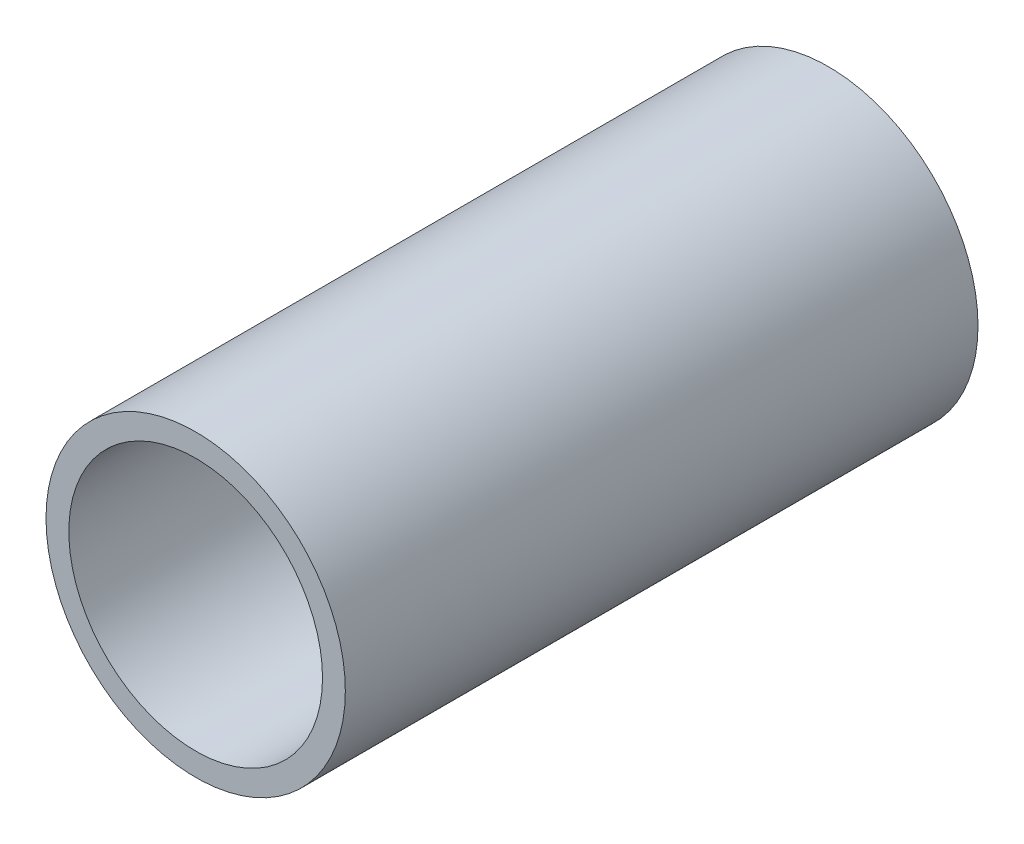
ISO-10303-21;
HEADER;
FILE_DESCRIPTION(('STEP AP214'),'2;1');
FILE_NAME('part.step','',(''),(''),'','','');
FILE_SCHEMA(('AUTOMOTIVE_DESIGN { 1 0 10303 214 1 1 1 1 }'));
ENDSEC;
DATA;
#1=APPLICATION_CONTEXT('core data for automotive mechanical design processes');
#2=APPLICATION_PROTOCOL_DEFINITION('international standard','automotive_design',2000,#1);
#3=PRODUCT_CONTEXT('',#1,'mechanical');
#4=PRODUCT('Part','Part','',(#3));
#5=PRODUCT_RELATED_PRODUCT_CATEGORY('part','',(#4));
#6=PRODUCT_DEFINITION_FORMATION('','',#4);
#7=PRODUCT_DEFINITION_CONTEXT('part definition',#1,'design');
#8=PRODUCT_DEFINITION('design','',#6,#7);
#9=PRODUCT_DEFINITION_SHAPE('','',#8);
#10=(LENGTH_UNIT() NAMED_UNIT(*) SI_UNIT(.MILLI.,.METRE.));
#11=(NAMED_UNIT(*) PLANE_ANGLE_UNIT() SI_UNIT($,.RADIAN.));
#12=(NAMED_UNIT(*) SI_UNIT($,.STERADIAN.) SOLID_ANGLE_UNIT());
#13=UNCERTAINTY_MEASURE_WITH_UNIT(LENGTH_MEASURE(1.E-05),#10,'distance_accuracy_value','');
#14=(GEOMETRIC_REPRESENTATION_CONTEXT(3) GLOBAL_UNCERTAINTY_ASSIGNED_CONTEXT((#13)) GLOBAL_UNIT_ASSIGNED_CONTEXT((#10,
#11,#12)) REPRESENTATION_CONTEXT('',''));
#15=CARTESIAN_POINT('',(0.,0.,0.));
#16=DIRECTION('',(0.,0.,1.));
#17=DIRECTION('',(1.,0.,0.));
#18=AXIS2_PLACEMENT_3D('',#15,#16,#17);
#19=CARTESIAN_POINT('',(0.,0.,51.));
#20=DIRECTION('',(0.,0.,1.));
#21=DIRECTION('',(1.,0.,0.));
#22=AXIS2_PLACEMENT_3D('',#19,#20,#21);
#23=PLANE('',#22);
#24=CARTESIAN_POINT('',(0.,0.,51.));
#25=DIRECTION('',(0.,0.,1.));
#26=DIRECTION('',(1.,0.,0.));
#27=AXIS2_PLACEMENT_3D('',#24,#25,#26);
#28=CIRCLE('',#27,24.13);
#29=CARTESIAN_POINT('',(24.13,0.,51.));
#30=VERTEX_POINT('',#29);
#31=EDGE_CURVE('E12',#30,#30,#28,.T.);
#32=ORIENTED_EDGE('',*,*,#31,.T.);
#33=EDGE_LOOP('',(#32));
#34=FACE_BOUND('',#33,.T.);
#35=CARTESIAN_POINT('',(0.,0.,51.));
#36=DIRECTION('',(0.,0.,1.));
#37=DIRECTION('',(1.,0.,0.));
#38=AXIS2_PLACEMENT_3D('',#35,#36,#37);
#39=CIRCLE('',#38,20.45);
#40=CARTESIAN_POINT('',(20.45,0.,51.));
#41=VERTEX_POINT('',#40);
#42=EDGE_CURVE('E54',#41,#41,#39,.T.);
#43=ORIENTED_EDGE('',*,*,#42,.F.);
#44=EDGE_LOOP('',(#43));
#45=FACE_BOUND('',#44,.T.);
#46=ADVANCED_FACE('F43',(#34,#45),#23,.T.);
#47=CARTESIAN_POINT('',(0.,0.,-51.));
#48=DIRECTION('',(0.,0.,1.));
#49=DIRECTION('',(1.,0.,0.));
#50=AXIS2_PLACEMENT_3D('',#47,#48,#49);
#51=PLANE('',#50);
#52=CARTESIAN_POINT('',(0.,0.,-51.));
#53=DIRECTION('',(0.,0.,1.));
#54=DIRECTION('',(1.,0.,0.));
#55=AXIS2_PLACEMENT_3D('',#52,#53,#54);
#56=CIRCLE('',#55,24.13);
#57=CARTESIAN_POINT('',(24.13,0.,-51.));
#58=VERTEX_POINT('',#57);
#59=EDGE_CURVE('E47',#58,#58,#56,.T.);
#60=ORIENTED_EDGE('',*,*,#59,.F.);
#61=EDGE_LOOP('',(#60));
#62=FACE_BOUND('',#61,.T.);
#63=CARTESIAN_POINT('',(0.,0.,-51.));
#64=DIRECTION('',(0.,0.,1.));
#65=DIRECTION('',(1.,0.,0.));
#66=AXIS2_PLACEMENT_3D('',#63,#64,#65);
#67=CIRCLE('',#66,20.45);
#68=CARTESIAN_POINT('',(20.45,0.,-51.));
#69=VERTEX_POINT('',#68);
#70=EDGE_CURVE('E56',#69,#69,#67,.T.);
#71=ORIENTED_EDGE('',*,*,#70,.T.);
#72=EDGE_LOOP('',(#71));
#73=FACE_BOUND('',#72,.T.);
#74=ADVANCED_FACE('F66',(#62,#73),#51,.F.);
#75=CARTESIAN_POINT('',(0.,0.,51.));
#76=DIRECTION('',(0.,0.,-1.));
#77=DIRECTION('',(-1.,0.,0.));
#78=AXIS2_PLACEMENT_3D('',#75,#76,#77);
#79=CYLINDRICAL_SURFACE('',#78,24.13);
#80=ORIENTED_EDGE('',*,*,#31,.F.);
#81=EDGE_LOOP('',(#80));
#82=FACE_BOUND('',#81,.T.);
#83=ORIENTED_EDGE('',*,*,#59,.T.);
#84=EDGE_LOOP('',(#83));
#85=FACE_BOUND('',#84,.T.);
#86=ADVANCED_FACE('F45',(#82,#85),#79,.T.);
#87=CARTESIAN_POINT('',(0.,0.,51.));
#88=DIRECTION('',(0.,0.,-1.));
#89=DIRECTION('',(-1.,0.,0.));
#90=AXIS2_PLACEMENT_3D('',#87,#88,#89);
#91=CYLINDRICAL_SURFACE('',#90,20.45);
#92=ORIENTED_EDGE('',*,*,#42,.T.);
#93=EDGE_LOOP('',(#92));
#94=FACE_BOUND('',#93,.T.);
#95=ORIENTED_EDGE('',*,*,#70,.F.);
#96=EDGE_LOOP('',(#95));
#97=FACE_BOUND('',#96,.T.);
#98=ADVANCED_FACE('F62',(#94,#97),#91,.F.);
#99=CLOSED_SHELL('',(#46,#74,#86,#98));
#100=MANIFOLD_SOLID_BREP('B2',#99);
#101=ADVANCED_BREP_SHAPE_REPRESENTATION('',(#18,#100),#14);
#102=SHAPE_DEFINITION_REPRESENTATION(#9,#101);
ENDSEC;
END-ISO-10303-21;
